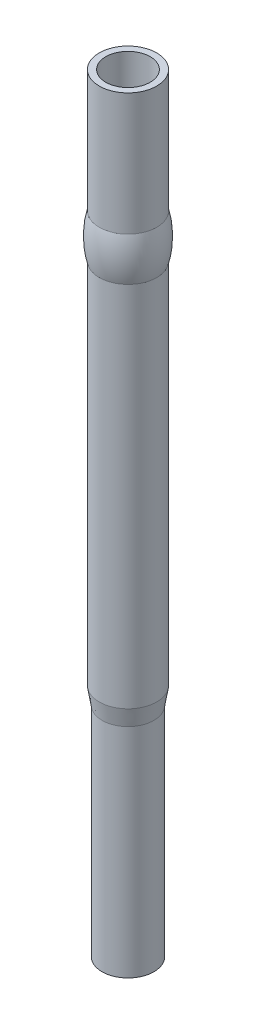
ISO-10303-21;
HEADER;
FILE_DESCRIPTION(('STEP AP214'),'2;1');
FILE_NAME('part.step','',(''),(''),'','','');
FILE_SCHEMA(('AUTOMOTIVE_DESIGN { 1 0 10303 214 1 1 1 1 }'));
ENDSEC;
DATA;
#1=APPLICATION_CONTEXT('core data for automotive mechanical design processes');
#2=APPLICATION_PROTOCOL_DEFINITION('international standard','automotive_design',2000,#1);
#3=PRODUCT_CONTEXT('',#1,'mechanical');
#4=PRODUCT('Part','Part','',(#3));
#5=PRODUCT_RELATED_PRODUCT_CATEGORY('part','',(#4));
#6=PRODUCT_DEFINITION_FORMATION('','',#4);
#7=PRODUCT_DEFINITION_CONTEXT('part definition',#1,'design');
#8=PRODUCT_DEFINITION('design','',#6,#7);
#9=PRODUCT_DEFINITION_SHAPE('','',#8);
#10=(LENGTH_UNIT() NAMED_UNIT(*) SI_UNIT(.MILLI.,.METRE.));
#11=(NAMED_UNIT(*) PLANE_ANGLE_UNIT() SI_UNIT($,.RADIAN.));
#12=(NAMED_UNIT(*) SI_UNIT($,.STERADIAN.) SOLID_ANGLE_UNIT());
#13=UNCERTAINTY_MEASURE_WITH_UNIT(LENGTH_MEASURE(1.E-05),#10,'distance_accuracy_value','');
#14=(GEOMETRIC_REPRESENTATION_CONTEXT(3) GLOBAL_UNCERTAINTY_ASSIGNED_CONTEXT((#13)) GLOBAL_UNIT_ASSIGNED_CONTEXT((#10,
#11,#12)) REPRESENTATION_CONTEXT('',''));
#15=CARTESIAN_POINT('',(0.,0.,0.));
#16=DIRECTION('',(0.,0.,1.));
#17=DIRECTION('',(1.,0.,0.));
#18=AXIS2_PLACEMENT_3D('',#15,#16,#17);
#19=CARTESIAN_POINT('',(0.,0.,-0.66));
#20=DIRECTION('',(0.,-1.,0.));
#21=DIRECTION('',(0.,0.,-1.));
#22=AXIS2_PLACEMENT_3D('',#19,#20,#21);
#23=PLANE('',#22);
#24=CARTESIAN_POINT('',(0.,0.,0.));
#25=DIRECTION('',(0.,1.,0.));
#26=DIRECTION('',(0.,0.,1.));
#27=AXIS2_PLACEMENT_3D('',#24,#25,#26);
#28=CIRCLE('',#27,0.51);
#29=CARTESIAN_POINT('',(0.,0.,0.51));
#30=VERTEX_POINT('',#29);
#31=EDGE_CURVE('E67',#30,#30,#28,.T.);
#32=ORIENTED_EDGE('',*,*,#31,.F.);
#33=EDGE_LOOP('',(#32));
#34=FACE_BOUND('',#33,.T.);
#35=CARTESIAN_POINT('',(0.,0.,0.));
#36=DIRECTION('',(0.,1.,0.));
#37=DIRECTION('',(0.,0.,1.));
#38=AXIS2_PLACEMENT_3D('',#35,#36,#37);
#39=CIRCLE('',#38,0.66);
#40=CARTESIAN_POINT('',(0.,0.,0.66));
#41=VERTEX_POINT('',#40);
#42=EDGE_CURVE('E10',#41,#41,#39,.T.);
#43=ORIENTED_EDGE('',*,*,#42,.T.);
#44=EDGE_LOOP('',(#43));
#45=FACE_BOUND('',#44,.T.);
#46=ADVANCED_FACE('F33',(#34,#45),#23,.F.);
#47=CARTESIAN_POINT('',(0.,-9.9,0.));
#48=DIRECTION('',(0.,1.,0.));
#49=DIRECTION('',(0.,0.,1.));
#50=AXIS2_PLACEMENT_3D('',#47,#48,#49);
#51=CYLINDRICAL_SURFACE('',#50,0.66);
#52=ORIENTED_EDGE('',*,*,#42,.F.);
#53=EDGE_LOOP('',(#52));
#54=FACE_BOUND('',#53,.T.);
#55=CARTESIAN_POINT('',(0.,-2.81,0.));
#56=DIRECTION('',(0.,1.,0.));
#57=DIRECTION('',(0.,0.,1.));
#58=AXIS2_PLACEMENT_3D('',#55,#56,#57);
#59=CIRCLE('',#58,0.66);
#60=CARTESIAN_POINT('',(0.,-2.81,0.66));
#61=VERTEX_POINT('',#60);
#62=EDGE_CURVE('E39',#61,#61,#59,.T.);
#63=ORIENTED_EDGE('',*,*,#62,.T.);
#64=EDGE_LOOP('',(#63));
#65=FACE_BOUND('',#64,.T.);
#66=ADVANCED_FACE('F74',(#54,#65),#51,.T.);
#67=CARTESIAN_POINT('',(0.,-3.31,0.));
#68=DIRECTION('',(0.,1.,0.));
#69=DIRECTION('',(0.,0.,1.));
#70=AXIS2_PLACEMENT_3D('',#67,#68,#69);
#71=DEGENERATE_TOROIDAL_SURFACE('',#70,1.2305769230769,1.9555769230769,.F.);
#72=ORIENTED_EDGE('',*,*,#62,.F.);
#73=EDGE_LOOP('',(#72));
#74=FACE_BOUND('',#73,.T.);
#75=CARTESIAN_POINT('',(0.,-3.81,0.));
#76=DIRECTION('',(0.,1.,0.));
#77=DIRECTION('',(0.,0.,1.));
#78=AXIS2_PLACEMENT_3D('',#75,#76,#77);
#79=CIRCLE('',#78,0.66);
#80=CARTESIAN_POINT('',(0.,-3.81,0.66));
#81=VERTEX_POINT('',#80);
#82=EDGE_CURVE('E43',#81,#81,#79,.T.);
#83=ORIENTED_EDGE('',*,*,#82,.T.);
#84=EDGE_LOOP('',(#83));
#85=FACE_BOUND('',#84,.T.);
#86=ADVANCED_FACE('F78',(#74,#85),#71,.F.);
#87=CARTESIAN_POINT('',(0.,-9.9,0.));
#88=DIRECTION('',(0.,1.,0.));
#89=DIRECTION('',(0.,0.,1.));
#90=AXIS2_PLACEMENT_3D('',#87,#88,#89);
#91=CYLINDRICAL_SURFACE('',#90,0.66);
#92=ORIENTED_EDGE('',*,*,#82,.F.);
#93=EDGE_LOOP('',(#92));
#94=FACE_BOUND('',#93,.T.);
#95=CARTESIAN_POINT('',(0.,-12.25,0.));
#96=DIRECTION('',(0.,1.,0.));
#97=DIRECTION('',(0.,0.,1.));
#98=AXIS2_PLACEMENT_3D('',#95,#96,#97);
#99=CIRCLE('',#98,0.66);
#100=CARTESIAN_POINT('',(0.,-12.25,0.66));
#101=VERTEX_POINT('',#100);
#102=EDGE_CURVE('E47',#101,#101,#99,.T.);
#103=ORIENTED_EDGE('',*,*,#102,.T.);
#104=EDGE_LOOP('',(#103));
#105=FACE_BOUND('',#104,.T.);
#106=ADVANCED_FACE('F83',(#94,#105),#91,.T.);
#107=CARTESIAN_POINT('',(0.,-12.65,0.));
#108=DIRECTION('',(0.,1.,0.));
#109=DIRECTION('',(0.,0.,1.));
#110=AXIS2_PLACEMENT_3D('',#107,#108,#109);
#111=CONICAL_SURFACE('',#110,0.595,0.161091904537581);
#112=ORIENTED_EDGE('',*,*,#102,.F.);
#113=EDGE_LOOP('',(#112));
#114=FACE_BOUND('',#113,.T.);
#115=CARTESIAN_POINT('',(0.,-12.65,0.));
#116=DIRECTION('',(0.,1.,0.));
#117=DIRECTION('',(0.,0.,1.));
#118=AXIS2_PLACEMENT_3D('',#115,#116,#117);
#119=CIRCLE('',#118,0.595);
#120=CARTESIAN_POINT('',(0.,-12.65,0.595));
#121=VERTEX_POINT('',#120);
#122=EDGE_CURVE('E52',#121,#121,#119,.T.);
#123=ORIENTED_EDGE('',*,*,#122,.T.);
#124=EDGE_LOOP('',(#123));
#125=FACE_BOUND('',#124,.T.);
#126=ADVANCED_FACE('F89',(#114,#125),#111,.T.);
#127=CARTESIAN_POINT('',(0.,-9.9,0.));
#128=DIRECTION('',(0.,1.,0.));
#129=DIRECTION('',(0.,0.,1.));
#130=AXIS2_PLACEMENT_3D('',#127,#128,#129);
#131=CYLINDRICAL_SURFACE('',#130,0.595);
#132=ORIENTED_EDGE('',*,*,#122,.F.);
#133=EDGE_LOOP('',(#132));
#134=FACE_BOUND('',#133,.T.);
#135=CARTESIAN_POINT('',(0.,-17.65,0.));
#136=DIRECTION('',(0.,1.,0.));
#137=DIRECTION('',(0.,0.,1.));
#138=AXIS2_PLACEMENT_3D('',#135,#136,#137);
#139=CIRCLE('',#138,0.595);
#140=CARTESIAN_POINT('',(0.,-17.65,0.595));
#141=VERTEX_POINT('',#140);
#142=EDGE_CURVE('E55',#141,#141,#139,.T.);
#143=ORIENTED_EDGE('',*,*,#142,.T.);
#144=EDGE_LOOP('',(#143));
#145=FACE_BOUND('',#144,.T.);
#146=ADVANCED_FACE('F93',(#134,#145),#131,.T.);
#147=CARTESIAN_POINT('',(0.,-17.65,-0.454999999999999));
#148=DIRECTION('',(0.,1.,0.));
#149=DIRECTION('',(0.,0.,1.));
#150=AXIS2_PLACEMENT_3D('',#147,#148,#149);
#151=PLANE('',#150);
#152=ORIENTED_EDGE('',*,*,#142,.F.);
#153=EDGE_LOOP('',(#152));
#154=FACE_BOUND('',#153,.T.);
#155=CARTESIAN_POINT('',(0.,-17.65,0.));
#156=DIRECTION('',(0.,1.,0.));
#157=DIRECTION('',(0.,0.,1.));
#158=AXIS2_PLACEMENT_3D('',#155,#156,#157);
#159=CIRCLE('',#158,0.454999999999999);
#160=CARTESIAN_POINT('',(0.,-17.65,0.454999999999999));
#161=VERTEX_POINT('',#160);
#162=EDGE_CURVE('E58',#161,#161,#159,.T.);
#163=ORIENTED_EDGE('',*,*,#162,.T.);
#164=EDGE_LOOP('',(#163));
#165=FACE_BOUND('',#164,.T.);
#166=ADVANCED_FACE('F97',(#154,#165),#151,.F.);
#167=CARTESIAN_POINT('',(0.,-9.9,0.));
#168=DIRECTION('',(0.,1.,0.));
#169=DIRECTION('',(0.,0.,1.));
#170=AXIS2_PLACEMENT_3D('',#167,#168,#169);
#171=CYLINDRICAL_SURFACE('',#170,0.454999999999999);
#172=ORIENTED_EDGE('',*,*,#162,.F.);
#173=EDGE_LOOP('',(#172));
#174=FACE_BOUND('',#173,.T.);
#175=CARTESIAN_POINT('',(0.,-12.65,0.));
#176=DIRECTION('',(0.,1.,0.));
#177=DIRECTION('',(0.,0.,1.));
#178=AXIS2_PLACEMENT_3D('',#175,#176,#177);
#179=CIRCLE('',#178,0.454999999999999);
#180=CARTESIAN_POINT('',(0.,-12.65,0.454999999999999));
#181=VERTEX_POINT('',#180);
#182=EDGE_CURVE('E61',#181,#181,#179,.T.);
#183=ORIENTED_EDGE('',*,*,#182,.T.);
#184=EDGE_LOOP('',(#183));
#185=FACE_BOUND('',#184,.T.);
#186=ADVANCED_FACE('F101',(#174,#185),#171,.F.);
#187=CARTESIAN_POINT('',(0.,-12.65,0.));
#188=DIRECTION('',(0.,1.,0.));
#189=DIRECTION('',(0.,0.,1.));
#190=AXIS2_PLACEMENT_3D('',#187,#188,#189);
#191=PLANE('',#190);
#192=ORIENTED_EDGE('',*,*,#182,.F.);
#193=EDGE_LOOP('',(#192));
#194=FACE_BOUND('',#193,.T.);
#195=ADVANCED_FACE('F105',(#194),#191,.F.);
#196=CARTESIAN_POINT('',(0.,-9.9,-0.510000000000001));
#197=DIRECTION('',(0.,-1.,0.));
#198=DIRECTION('',(0.,0.,-1.));
#199=AXIS2_PLACEMENT_3D('',#196,#197,#198);
#200=PLANE('',#199);
#201=CARTESIAN_POINT('',(0.,-9.9,0.));
#202=DIRECTION('',(0.,1.,0.));
#203=DIRECTION('',(0.,0.,1.));
#204=AXIS2_PLACEMENT_3D('',#201,#202,#203);
#205=CIRCLE('',#204,0.510000000000001);
#206=CARTESIAN_POINT('',(0.,-9.9,0.510000000000001));
#207=VERTEX_POINT('',#206);
#208=EDGE_CURVE('E64',#207,#207,#205,.T.);
#209=ORIENTED_EDGE('',*,*,#208,.T.);
#210=EDGE_LOOP('',(#209));
#211=FACE_BOUND('',#210,.T.);
#212=ADVANCED_FACE('F109',(#211),#200,.F.);
#213=CARTESIAN_POINT('',(0.,-9.9,0.));
#214=DIRECTION('',(0.,1.,0.));
#215=DIRECTION('',(0.,0.,1.));
#216=AXIS2_PLACEMENT_3D('',#213,#214,#215);
#217=CYLINDRICAL_SURFACE('',#216,0.510000000000001);
#218=ORIENTED_EDGE('',*,*,#208,.F.);
#219=EDGE_LOOP('',(#218));
#220=FACE_BOUND('',#219,.T.);
#221=ORIENTED_EDGE('',*,*,#31,.T.);
#222=EDGE_LOOP('',(#221));
#223=FACE_BOUND('',#222,.T.);
#224=ADVANCED_FACE('F71',(#220,#223),#217,.F.);
#225=CLOSED_SHELL('',(#46,#66,#86,#106,#126,#146,#166,#186,#195,#212,#224));
#226=MANIFOLD_SOLID_BREP('B2',#225);
#227=ADVANCED_BREP_SHAPE_REPRESENTATION('',(#18,#226),#14);
#228=SHAPE_DEFINITION_REPRESENTATION(#9,#227);
ENDSEC;
END-ISO-10303-21;
